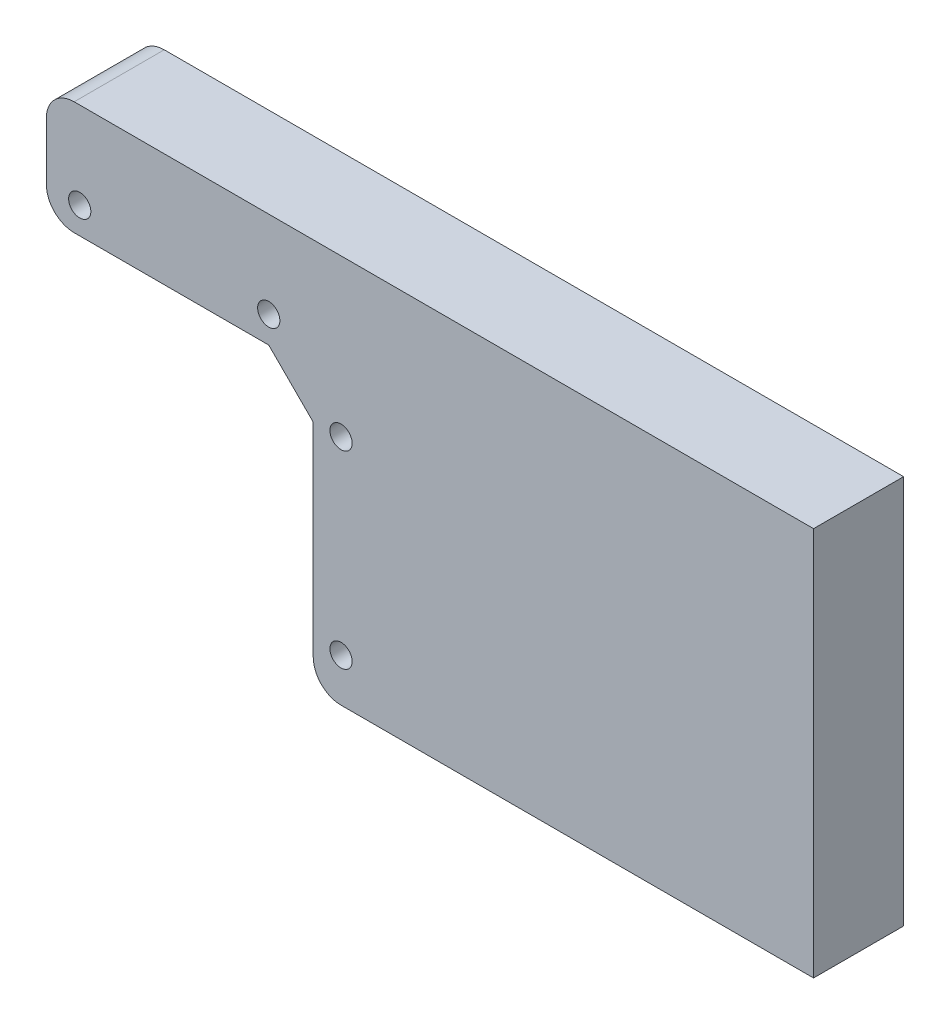
ISO-10303-21;
HEADER;
FILE_DESCRIPTION(('STEP AP214'),'2;1');
FILE_NAME('part.step','',(''),(''),'','','');
FILE_SCHEMA(('AUTOMOTIVE_DESIGN { 1 0 10303 214 1 1 1 1 }'));
ENDSEC;
DATA;
#1=APPLICATION_CONTEXT('core data for automotive mechanical design processes');
#2=APPLICATION_PROTOCOL_DEFINITION('international standard','automotive_design',2000,#1);
#3=PRODUCT_CONTEXT('',#1,'mechanical');
#4=PRODUCT('Part','Part','',(#3));
#5=PRODUCT_RELATED_PRODUCT_CATEGORY('part','',(#4));
#6=PRODUCT_DEFINITION_FORMATION('','',#4);
#7=PRODUCT_DEFINITION_CONTEXT('part definition',#1,'design');
#8=PRODUCT_DEFINITION('design','',#6,#7);
#9=PRODUCT_DEFINITION_SHAPE('','',#8);
#10=(LENGTH_UNIT() NAMED_UNIT(*) SI_UNIT(.MILLI.,.METRE.));
#11=(NAMED_UNIT(*) PLANE_ANGLE_UNIT() SI_UNIT($,.RADIAN.));
#12=(NAMED_UNIT(*) SI_UNIT($,.STERADIAN.) SOLID_ANGLE_UNIT());
#13=UNCERTAINTY_MEASURE_WITH_UNIT(LENGTH_MEASURE(1.E-05),#10,'distance_accuracy_value','');
#14=(GEOMETRIC_REPRESENTATION_CONTEXT(3) GLOBAL_UNCERTAINTY_ASSIGNED_CONTEXT((#13)) GLOBAL_UNIT_ASSIGNED_CONTEXT((#10,
#11,#12)) REPRESENTATION_CONTEXT('',''));
#15=CARTESIAN_POINT('',(0.,0.,0.));
#16=DIRECTION('',(0.,0.,1.));
#17=DIRECTION('',(1.,0.,0.));
#18=AXIS2_PLACEMENT_3D('',#15,#16,#17);
#19=CARTESIAN_POINT('',(0.,0.,8.1));
#20=DIRECTION('',(1.,0.,0.));
#21=DIRECTION('',(0.,0.,-1.));
#22=AXIS2_PLACEMENT_3D('',#19,#20,#21);
#23=PLANE('',#22);
#24=DIRECTION('',(0.,-1.,0.));
#25=VECTOR('',#24,1.);
#26=CARTESIAN_POINT('',(0.,0.,0.));
#27=LINE('',#26,#25);
#28=CARTESIAN_POINT('',(0.,20.8,0.));
#29=VERTEX_POINT('',#28);
#30=CARTESIAN_POINT('',(0.,2.5,0.));
#31=VERTEX_POINT('',#30);
#32=EDGE_CURVE('E141',#29,#31,#27,.T.);
#33=ORIENTED_EDGE('',*,*,#32,.T.);
#34=DIRECTION('',(0.,0.,-1.));
#35=VECTOR('',#34,1.);
#36=CARTESIAN_POINT('',(0.,2.5,8.1));
#37=LINE('',#36,#35);
#38=CARTESIAN_POINT('',(0.,2.5,8.1));
#39=VERTEX_POINT('',#38);
#40=EDGE_CURVE('E11',#31,#39,#37,.F.);
#41=ORIENTED_EDGE('',*,*,#40,.T.);
#42=DIRECTION('',(0.,-1.,0.));
#43=VECTOR('',#42,1.);
#44=CARTESIAN_POINT('',(0.,0.,8.1));
#45=LINE('',#44,#43);
#46=CARTESIAN_POINT('',(0.,20.8,8.1));
#47=VERTEX_POINT('',#46);
#48=EDGE_CURVE('E121',#47,#39,#45,.T.);
#49=ORIENTED_EDGE('',*,*,#48,.F.);
#50=DIRECTION('',(0.,0.,-1.));
#51=VECTOR('',#50,1.);
#52=CARTESIAN_POINT('',(0.,20.8,8.1));
#53=LINE('',#52,#51);
#54=EDGE_CURVE('E154',#47,#29,#53,.T.);
#55=ORIENTED_EDGE('',*,*,#54,.T.);
#56=EDGE_LOOP('',(#33,#41,#49,#55));
#57=FACE_BOUND('',#56,.T.);
#58=ADVANCED_FACE('F33',(#57),#23,.F.);
#59=CARTESIAN_POINT('',(0.,0.,8.1));
#60=DIRECTION('',(0.,1.,0.));
#61=DIRECTION('',(0.,0.,1.));
#62=AXIS2_PLACEMENT_3D('',#59,#60,#61);
#63=PLANE('',#62);
#64=DIRECTION('',(1.,0.,0.));
#65=VECTOR('',#64,1.);
#66=CARTESIAN_POINT('',(0.,0.,8.1));
#67=LINE('',#66,#65);
#68=CARTESIAN_POINT('',(2.5,0.,8.1));
#69=VERTEX_POINT('',#68);
#70=CARTESIAN_POINT('',(45.,0.,8.1));
#71=VERTEX_POINT('',#70);
#72=EDGE_CURVE('E110',#69,#71,#67,.T.);
#73=ORIENTED_EDGE('',*,*,#72,.F.);
#74=DIRECTION('',(0.,0.,-1.));
#75=VECTOR('',#74,1.);
#76=CARTESIAN_POINT('',(2.5,0.,8.1));
#77=LINE('',#76,#75);
#78=CARTESIAN_POINT('',(2.5,0.,0.));
#79=VERTEX_POINT('',#78);
#80=EDGE_CURVE('E41',#69,#79,#77,.T.);
#81=ORIENTED_EDGE('',*,*,#80,.T.);
#82=DIRECTION('',(1.,0.,0.));
#83=VECTOR('',#82,1.);
#84=CARTESIAN_POINT('',(0.,0.,0.));
#85=LINE('',#84,#83);
#86=CARTESIAN_POINT('',(45.,0.,0.));
#87=VERTEX_POINT('',#86);
#88=EDGE_CURVE('E127',#79,#87,#85,.T.);
#89=ORIENTED_EDGE('',*,*,#88,.T.);
#90=DIRECTION('',(0.,0.,-1.));
#91=VECTOR('',#90,1.);
#92=CARTESIAN_POINT('',(45.,0.,8.1));
#93=LINE('',#92,#91);
#94=EDGE_CURVE('E124',#71,#87,#93,.T.);
#95=ORIENTED_EDGE('',*,*,#94,.F.);
#96=EDGE_LOOP('',(#73,#81,#89,#95));
#97=FACE_BOUND('',#96,.T.);
#98=ADVANCED_FACE('F125',(#97),#63,.F.);
#99=CARTESIAN_POINT('',(45.,0.,8.1));
#100=DIRECTION('',(-1.,0.,0.));
#101=DIRECTION('',(0.,0.,1.));
#102=AXIS2_PLACEMENT_3D('',#99,#100,#101);
#103=PLANE('',#102);
#104=DIRECTION('',(0.,1.,0.));
#105=VECTOR('',#104,1.);
#106=CARTESIAN_POINT('',(45.,0.,0.));
#107=LINE('',#106,#105);
#108=CARTESIAN_POINT('',(45.,35.,0.));
#109=VERTEX_POINT('',#108);
#110=EDGE_CURVE('E146',#87,#109,#107,.T.);
#111=ORIENTED_EDGE('',*,*,#110,.T.);
#112=DIRECTION('',(0.,0.,-1.));
#113=VECTOR('',#112,1.);
#114=CARTESIAN_POINT('',(45.,35.,8.1));
#115=LINE('',#114,#113);
#116=CARTESIAN_POINT('',(45.,35.,8.1));
#117=VERTEX_POINT('',#116);
#118=EDGE_CURVE('E131',#117,#109,#115,.T.);
#119=ORIENTED_EDGE('',*,*,#118,.F.);
#120=DIRECTION('',(0.,1.,0.));
#121=VECTOR('',#120,1.);
#122=CARTESIAN_POINT('',(45.,0.,8.1));
#123=LINE('',#122,#121);
#124=EDGE_CURVE('E115',#71,#117,#123,.T.);
#125=ORIENTED_EDGE('',*,*,#124,.F.);
#126=ORIENTED_EDGE('',*,*,#94,.T.);
#127=EDGE_LOOP('',(#111,#119,#125,#126));
#128=FACE_BOUND('',#127,.T.);
#129=ADVANCED_FACE('F133',(#128),#103,.F.);
#130=CARTESIAN_POINT('',(0.,35.,8.1));
#131=DIRECTION('',(0.,-1.,0.));
#132=DIRECTION('',(0.,0.,-1.));
#133=AXIS2_PLACEMENT_3D('',#130,#131,#132);
#134=PLANE('',#133);
#135=DIRECTION('',(-1.,0.,0.));
#136=VECTOR('',#135,1.);
#137=CARTESIAN_POINT('',(0.,35.,0.));
#138=LINE('',#137,#136);
#139=CARTESIAN_POINT('',(-21.5,35.,0.));
#140=VERTEX_POINT('',#139);
#141=EDGE_CURVE('E148',#109,#140,#138,.T.);
#142=ORIENTED_EDGE('',*,*,#141,.T.);
#143=DIRECTION('',(0.,0.,1.));
#144=VECTOR('',#143,1.);
#145=CARTESIAN_POINT('',(-21.5,35.,8.1));
#146=LINE('',#145,#144);
#147=CARTESIAN_POINT('',(-21.5,35.,8.1));
#148=VERTEX_POINT('',#147);
#149=EDGE_CURVE('E161',#140,#148,#146,.T.);
#150=ORIENTED_EDGE('',*,*,#149,.T.);
#151=DIRECTION('',(-1.,0.,0.));
#152=VECTOR('',#151,1.);
#153=CARTESIAN_POINT('',(0.,35.,8.1));
#154=LINE('',#153,#152);
#155=EDGE_CURVE('E136',#117,#148,#154,.T.);
#156=ORIENTED_EDGE('',*,*,#155,.F.);
#157=ORIENTED_EDGE('',*,*,#118,.T.);
#158=EDGE_LOOP('',(#142,#150,#156,#157));
#159=FACE_BOUND('',#158,.T.);
#160=ADVANCED_FACE('F185',(#159),#134,.F.);
#161=CARTESIAN_POINT('',(0.,0.,8.1));
#162=DIRECTION('',(0.,0.,-1.));
#163=DIRECTION('',(-1.,0.,0.));
#164=AXIS2_PLACEMENT_3D('',#161,#162,#163);
#165=PLANE('',#164);
#166=CARTESIAN_POINT('',(-21.,27.2,8.1));
#167=DIRECTION('',(0.,0.,1.));
#168=DIRECTION('',(1.,0.,0.));
#169=AXIS2_PLACEMENT_3D('',#166,#167,#168);
#170=CIRCLE('',#169,1.);
#171=CARTESIAN_POINT('',(-20.,27.2,8.1));
#172=VERTEX_POINT('',#171);
#173=EDGE_CURVE('E390',#172,#172,#170,.T.);
#174=ORIENTED_EDGE('',*,*,#173,.F.);
#175=EDGE_LOOP('',(#174));
#176=FACE_BOUND('',#175,.T.);
#177=CARTESIAN_POINT('',(2.5,20.9,8.1));
#178=DIRECTION('',(0.,0.,1.));
#179=DIRECTION('',(1.,0.,0.));
#180=AXIS2_PLACEMENT_3D('',#177,#178,#179);
#181=CIRCLE('',#180,1.);
#182=CARTESIAN_POINT('',(3.5,20.9,8.1));
#183=VERTEX_POINT('',#182);
#184=EDGE_CURVE('E386',#183,#183,#181,.T.);
#185=ORIENTED_EDGE('',*,*,#184,.F.);
#186=EDGE_LOOP('',(#185));
#187=FACE_BOUND('',#186,.T.);
#188=CARTESIAN_POINT('',(2.5,3.9,8.1));
#189=DIRECTION('',(0.,0.,1.));
#190=DIRECTION('',(1.,0.,0.));
#191=AXIS2_PLACEMENT_3D('',#188,#189,#190);
#192=CIRCLE('',#191,1.);
#193=CARTESIAN_POINT('',(3.5,3.9,8.1));
#194=VERTEX_POINT('',#193);
#195=EDGE_CURVE('E382',#194,#194,#192,.T.);
#196=ORIENTED_EDGE('',*,*,#195,.F.);
#197=EDGE_LOOP('',(#196));
#198=FACE_BOUND('',#197,.T.);
#199=CARTESIAN_POINT('',(-4.,27.2,8.1));
#200=DIRECTION('',(0.,0.,1.));
#201=DIRECTION('',(1.,0.,0.));
#202=AXIS2_PLACEMENT_3D('',#199,#200,#201);
#203=CIRCLE('',#202,1.);
#204=CARTESIAN_POINT('',(-3.,27.2,8.1));
#205=VERTEX_POINT('',#204);
#206=EDGE_CURVE('E207',#205,#205,#203,.T.);
#207=ORIENTED_EDGE('',*,*,#206,.F.);
#208=EDGE_LOOP('',(#207));
#209=FACE_BOUND('',#208,.T.);
#210=ORIENTED_EDGE('',*,*,#155,.T.);
#211=CARTESIAN_POINT('',(-21.5,32.5,8.1));
#212=DIRECTION('',(0.,0.,-1.));
#213=DIRECTION('',(-1.,0.,0.));
#214=AXIS2_PLACEMENT_3D('',#211,#212,#213);
#215=CIRCLE('',#214,2.5);
#216=CARTESIAN_POINT('',(-24.,32.5,8.1));
#217=VERTEX_POINT('',#216);
#218=EDGE_CURVE('E167',#148,#217,#215,.F.);
#219=ORIENTED_EDGE('',*,*,#218,.T.);
#220=DIRECTION('',(0.,-1.,0.));
#221=VECTOR('',#220,1.);
#222=CARTESIAN_POINT('',(-24.,35.,8.1));
#223=LINE('',#222,#221);
#224=CARTESIAN_POINT('',(-24.,27.3,8.1));
#225=VERTEX_POINT('',#224);
#226=EDGE_CURVE('E189',#217,#225,#223,.T.);
#227=ORIENTED_EDGE('',*,*,#226,.T.);
#228=CARTESIAN_POINT('',(-21.5,27.3,8.1));
#229=DIRECTION('',(0.,0.,-1.));
#230=DIRECTION('',(-1.,0.,0.));
#231=AXIS2_PLACEMENT_3D('',#228,#229,#230);
#232=CIRCLE('',#231,2.5);
#233=CARTESIAN_POINT('',(-21.5,24.8,8.1));
#234=VERTEX_POINT('',#233);
#235=EDGE_CURVE('E165',#225,#234,#232,.F.);
#236=ORIENTED_EDGE('',*,*,#235,.T.);
#237=DIRECTION('',(1.,0.,0.));
#238=VECTOR('',#237,1.);
#239=CARTESIAN_POINT('',(0.,24.8,8.1));
#240=LINE('',#239,#238);
#241=CARTESIAN_POINT('',(-4.00000000000002,24.8,8.1));
#242=VERTEX_POINT('',#241);
#243=EDGE_CURVE('E196',#234,#242,#240,.T.);
#244=ORIENTED_EDGE('',*,*,#243,.T.);
#245=DIRECTION('',(0.707106781186551,-0.707106781186544,0.));
#246=VECTOR('',#245,1.);
#247=CARTESIAN_POINT('',(10.4,10.4000000000001,8.1));
#248=LINE('',#247,#246);
#249=EDGE_CURVE('E156',#242,#47,#248,.T.);
#250=ORIENTED_EDGE('',*,*,#249,.T.);
#251=ORIENTED_EDGE('',*,*,#48,.T.);
#252=CARTESIAN_POINT('',(2.5,2.5,8.1));
#253=DIRECTION('',(0.,0.,-1.));
#254=DIRECTION('',(-1.,0.,0.));
#255=AXIS2_PLACEMENT_3D('',#252,#253,#254);
#256=CIRCLE('',#255,2.5);
#257=EDGE_CURVE('E119',#39,#69,#256,.F.);
#258=ORIENTED_EDGE('',*,*,#257,.T.);
#259=ORIENTED_EDGE('',*,*,#72,.T.);
#260=ORIENTED_EDGE('',*,*,#124,.T.);
#261=EDGE_LOOP('',(#210,#219,#227,#236,#244,#250,#251,#258,#259,#260));
#262=FACE_BOUND('',#261,.T.);
#263=ADVANCED_FACE('F113',(#176,#187,#198,#209,#262),#165,.F.);
#264=CARTESIAN_POINT('',(0.,0.,0.));
#265=DIRECTION('',(0.,0.,-1.));
#266=DIRECTION('',(-1.,0.,0.));
#267=AXIS2_PLACEMENT_3D('',#264,#265,#266);
#268=PLANE('',#267);
#269=CARTESIAN_POINT('',(-21.,27.2,0.));
#270=DIRECTION('',(0.,0.,1.));
#271=DIRECTION('',(1.,0.,0.));
#272=AXIS2_PLACEMENT_3D('',#269,#270,#271);
#273=CIRCLE('',#272,1.);
#274=CARTESIAN_POINT('',(-20.,27.2,0.));
#275=VERTEX_POINT('',#274);
#276=EDGE_CURVE('E369',#275,#275,#273,.T.);
#277=ORIENTED_EDGE('',*,*,#276,.T.);
#278=EDGE_LOOP('',(#277));
#279=FACE_BOUND('',#278,.T.);
#280=CARTESIAN_POINT('',(2.5,20.9,0.));
#281=DIRECTION('',(0.,0.,1.));
#282=DIRECTION('',(1.,0.,0.));
#283=AXIS2_PLACEMENT_3D('',#280,#281,#282);
#284=CIRCLE('',#283,1.);
#285=CARTESIAN_POINT('',(3.5,20.9,0.));
#286=VERTEX_POINT('',#285);
#287=EDGE_CURVE('E373',#286,#286,#284,.T.);
#288=ORIENTED_EDGE('',*,*,#287,.T.);
#289=EDGE_LOOP('',(#288));
#290=FACE_BOUND('',#289,.T.);
#291=CARTESIAN_POINT('',(2.5,3.9,0.));
#292=DIRECTION('',(0.,0.,1.));
#293=DIRECTION('',(1.,0.,0.));
#294=AXIS2_PLACEMENT_3D('',#291,#292,#293);
#295=CIRCLE('',#294,1.);
#296=CARTESIAN_POINT('',(3.5,3.9,0.));
#297=VERTEX_POINT('',#296);
#298=EDGE_CURVE('E377',#297,#297,#295,.T.);
#299=ORIENTED_EDGE('',*,*,#298,.T.);
#300=EDGE_LOOP('',(#299));
#301=FACE_BOUND('',#300,.T.);
#302=CARTESIAN_POINT('',(-4.,27.2,0.));
#303=DIRECTION('',(0.,0.,1.));
#304=DIRECTION('',(1.,0.,0.));
#305=AXIS2_PLACEMENT_3D('',#302,#303,#304);
#306=CIRCLE('',#305,1.);
#307=CARTESIAN_POINT('',(-3.,27.2,0.));
#308=VERTEX_POINT('',#307);
#309=EDGE_CURVE('E197',#308,#308,#306,.T.);
#310=ORIENTED_EDGE('',*,*,#309,.T.);
#311=EDGE_LOOP('',(#310));
#312=FACE_BOUND('',#311,.T.);
#313=DIRECTION('',(0.,-1.,0.));
#314=VECTOR('',#313,1.);
#315=CARTESIAN_POINT('',(-24.,35.,0.));
#316=LINE('',#315,#314);
#317=CARTESIAN_POINT('',(-24.,32.5,0.));
#318=VERTEX_POINT('',#317);
#319=CARTESIAN_POINT('',(-24.,27.3,0.));
#320=VERTEX_POINT('',#319);
#321=EDGE_CURVE('E201',#318,#320,#316,.T.);
#322=ORIENTED_EDGE('',*,*,#321,.F.);
#323=CARTESIAN_POINT('',(-21.5,32.5,0.));
#324=DIRECTION('',(0.,0.,-1.));
#325=DIRECTION('',(-1.,0.,0.));
#326=AXIS2_PLACEMENT_3D('',#323,#324,#325);
#327=CIRCLE('',#326,2.5);
#328=EDGE_CURVE('E177',#318,#140,#327,.T.);
#329=ORIENTED_EDGE('',*,*,#328,.T.);
#330=ORIENTED_EDGE('',*,*,#141,.F.);
#331=ORIENTED_EDGE('',*,*,#110,.F.);
#332=ORIENTED_EDGE('',*,*,#88,.F.);
#333=CARTESIAN_POINT('',(2.5,2.5,0.));
#334=DIRECTION('',(0.,0.,-1.));
#335=DIRECTION('',(-1.,0.,0.));
#336=AXIS2_PLACEMENT_3D('',#333,#334,#335);
#337=CIRCLE('',#336,2.5);
#338=EDGE_CURVE('E48',#79,#31,#337,.T.);
#339=ORIENTED_EDGE('',*,*,#338,.T.);
#340=ORIENTED_EDGE('',*,*,#32,.F.);
#341=DIRECTION('',(-0.707106781186551,0.707106781186544,0.));
#342=VECTOR('',#341,1.);
#343=CARTESIAN_POINT('',(-4.00000000000002,24.8,0.));
#344=LINE('',#343,#342);
#345=CARTESIAN_POINT('',(-4.00000000000002,24.8,0.));
#346=VERTEX_POINT('',#345);
#347=EDGE_CURVE('E158',#29,#346,#344,.T.);
#348=ORIENTED_EDGE('',*,*,#347,.T.);
#349=DIRECTION('',(1.,0.,0.));
#350=VECTOR('',#349,1.);
#351=CARTESIAN_POINT('',(0.,24.8,0.));
#352=LINE('',#351,#350);
#353=CARTESIAN_POINT('',(-21.5,24.8,0.));
#354=VERTEX_POINT('',#353);
#355=EDGE_CURVE('E144',#354,#346,#352,.T.);
#356=ORIENTED_EDGE('',*,*,#355,.F.);
#357=CARTESIAN_POINT('',(-21.5,27.3,0.));
#358=DIRECTION('',(0.,0.,-1.));
#359=DIRECTION('',(-1.,0.,0.));
#360=AXIS2_PLACEMENT_3D('',#357,#358,#359);
#361=CIRCLE('',#360,2.5);
#362=EDGE_CURVE('E175',#354,#320,#361,.T.);
#363=ORIENTED_EDGE('',*,*,#362,.T.);
#364=EDGE_LOOP('',(#322,#329,#330,#331,#332,#339,#340,#348,#356,#363));
#365=FACE_BOUND('',#364,.T.);
#366=ADVANCED_FACE('F181',(#279,#290,#301,#312,#365),#268,.T.);
#367=CARTESIAN_POINT('',(0.,24.8,0.));
#368=DIRECTION('',(0.,-1.,0.));
#369=DIRECTION('',(1.,0.,0.));
#370=AXIS2_PLACEMENT_3D('',#367,#368,#369);
#371=PLANE('',#370);
#372=ORIENTED_EDGE('',*,*,#243,.F.);
#373=DIRECTION('',(0.,0.,1.));
#374=VECTOR('',#373,1.);
#375=CARTESIAN_POINT('',(-21.5,24.8,0.));
#376=LINE('',#375,#374);
#377=EDGE_CURVE('E56',#234,#354,#376,.F.);
#378=ORIENTED_EDGE('',*,*,#377,.T.);
#379=ORIENTED_EDGE('',*,*,#355,.T.);
#380=DIRECTION('',(0.,0.,1.));
#381=VECTOR('',#380,1.);
#382=CARTESIAN_POINT('',(-4.00000000000002,24.8,0.));
#383=LINE('',#382,#381);
#384=EDGE_CURVE('E130',#346,#242,#383,.T.);
#385=ORIENTED_EDGE('',*,*,#384,.T.);
#386=EDGE_LOOP('',(#372,#378,#379,#385));
#387=FACE_BOUND('',#386,.T.);
#388=ADVANCED_FACE('F217',(#387),#371,.T.);
#389=CARTESIAN_POINT('',(-24.,35.,0.));
#390=DIRECTION('',(-1.,0.,0.));
#391=DIRECTION('',(0.,0.,1.));
#392=AXIS2_PLACEMENT_3D('',#389,#390,#391);
#393=PLANE('',#392);
#394=ORIENTED_EDGE('',*,*,#226,.F.);
#395=DIRECTION('',(0.,0.,1.));
#396=VECTOR('',#395,1.);
#397=CARTESIAN_POINT('',(-24.,32.5,0.));
#398=LINE('',#397,#396);
#399=EDGE_CURVE('E172',#217,#318,#398,.F.);
#400=ORIENTED_EDGE('',*,*,#399,.T.);
#401=ORIENTED_EDGE('',*,*,#321,.T.);
#402=DIRECTION('',(0.,0.,1.));
#403=VECTOR('',#402,1.);
#404=CARTESIAN_POINT('',(-24.,27.3,0.));
#405=LINE('',#404,#403);
#406=EDGE_CURVE('E169',#320,#225,#405,.T.);
#407=ORIENTED_EDGE('',*,*,#406,.T.);
#408=EDGE_LOOP('',(#394,#400,#401,#407));
#409=FACE_BOUND('',#408,.T.);
#410=ADVANCED_FACE('F193',(#409),#393,.T.);
#411=CARTESIAN_POINT('',(-4.,27.2,0.));
#412=DIRECTION('',(0.,0.,1.));
#413=DIRECTION('',(1.,0.,0.));
#414=AXIS2_PLACEMENT_3D('',#411,#412,#413);
#415=CYLINDRICAL_SURFACE('',#414,1.);
#416=ORIENTED_EDGE('',*,*,#309,.F.);
#417=EDGE_LOOP('',(#416));
#418=FACE_BOUND('',#417,.T.);
#419=ORIENTED_EDGE('',*,*,#206,.T.);
#420=EDGE_LOOP('',(#419));
#421=FACE_BOUND('',#420,.T.);
#422=ADVANCED_FACE('F253',(#418,#421),#415,.F.);
#423=CARTESIAN_POINT('',(2.5,3.9,0.));
#424=DIRECTION('',(0.,0.,1.));
#425=DIRECTION('',(1.,0.,0.));
#426=AXIS2_PLACEMENT_3D('',#423,#424,#425);
#427=CYLINDRICAL_SURFACE('',#426,1.);
#428=ORIENTED_EDGE('',*,*,#298,.F.);
#429=EDGE_LOOP('',(#428));
#430=FACE_BOUND('',#429,.T.);
#431=ORIENTED_EDGE('',*,*,#195,.T.);
#432=EDGE_LOOP('',(#431));
#433=FACE_BOUND('',#432,.T.);
#434=ADVANCED_FACE('F245',(#430,#433),#427,.F.);
#435=CARTESIAN_POINT('',(2.5,20.9,0.));
#436=DIRECTION('',(0.,0.,1.));
#437=DIRECTION('',(1.,0.,0.));
#438=AXIS2_PLACEMENT_3D('',#435,#436,#437);
#439=CYLINDRICAL_SURFACE('',#438,1.);
#440=ORIENTED_EDGE('',*,*,#287,.F.);
#441=EDGE_LOOP('',(#440));
#442=FACE_BOUND('',#441,.T.);
#443=ORIENTED_EDGE('',*,*,#184,.T.);
#444=EDGE_LOOP('',(#443));
#445=FACE_BOUND('',#444,.T.);
#446=ADVANCED_FACE('F239',(#442,#445),#439,.F.);
#447=CARTESIAN_POINT('',(-21.,27.2,0.));
#448=DIRECTION('',(0.,0.,1.));
#449=DIRECTION('',(1.,0.,0.));
#450=AXIS2_PLACEMENT_3D('',#447,#448,#449);
#451=CYLINDRICAL_SURFACE('',#450,1.);
#452=ORIENTED_EDGE('',*,*,#276,.F.);
#453=EDGE_LOOP('',(#452));
#454=FACE_BOUND('',#453,.T.);
#455=ORIENTED_EDGE('',*,*,#173,.T.);
#456=EDGE_LOOP('',(#455));
#457=FACE_BOUND('',#456,.T.);
#458=ADVANCED_FACE('F235',(#454,#457),#451,.F.);
#459=CARTESIAN_POINT('',(-4.00000000000002,24.8,0.));
#460=DIRECTION('',(0.707106781186544,0.70710678118655,0.));
#461=DIRECTION('',(0.,0.,1.));
#462=AXIS2_PLACEMENT_3D('',#459,#460,#461);
#463=PLANE('',#462);
#464=ORIENTED_EDGE('',*,*,#347,.F.);
#465=ORIENTED_EDGE('',*,*,#54,.F.);
#466=ORIENTED_EDGE('',*,*,#249,.F.);
#467=ORIENTED_EDGE('',*,*,#384,.F.);
#468=EDGE_LOOP('',(#464,#465,#466,#467));
#469=FACE_BOUND('',#468,.T.);
#470=ADVANCED_FACE('F216',(#469),#463,.F.);
#471=CARTESIAN_POINT('',(-21.5,32.5,8.1));
#472=DIRECTION('',(0.,0.,-1.));
#473=DIRECTION('',(-1.,0.,0.));
#474=AXIS2_PLACEMENT_3D('',#471,#472,#473);
#475=CYLINDRICAL_SURFACE('',#474,2.5);
#476=ORIENTED_EDGE('',*,*,#328,.F.);
#477=ORIENTED_EDGE('',*,*,#399,.F.);
#478=ORIENTED_EDGE('',*,*,#218,.F.);
#479=ORIENTED_EDGE('',*,*,#149,.F.);
#480=EDGE_LOOP('',(#476,#477,#478,#479));
#481=FACE_BOUND('',#480,.T.);
#482=ADVANCED_FACE('F200',(#481),#475,.T.);
#483=CARTESIAN_POINT('',(-21.5,27.3,0.));
#484=DIRECTION('',(0.,0.,1.));
#485=DIRECTION('',(1.,0.,0.));
#486=AXIS2_PLACEMENT_3D('',#483,#484,#485);
#487=CYLINDRICAL_SURFACE('',#486,2.5);
#488=ORIENTED_EDGE('',*,*,#362,.F.);
#489=ORIENTED_EDGE('',*,*,#377,.F.);
#490=ORIENTED_EDGE('',*,*,#235,.F.);
#491=ORIENTED_EDGE('',*,*,#406,.F.);
#492=EDGE_LOOP('',(#488,#489,#490,#491));
#493=FACE_BOUND('',#492,.T.);
#494=ADVANCED_FACE('F219',(#493),#487,.T.);
#495=CARTESIAN_POINT('',(2.5,2.5,8.1));
#496=DIRECTION('',(0.,0.,-1.));
#497=DIRECTION('',(-1.,0.,0.));
#498=AXIS2_PLACEMENT_3D('',#495,#496,#497);
#499=CYLINDRICAL_SURFACE('',#498,2.5);
#500=ORIENTED_EDGE('',*,*,#257,.F.);
#501=ORIENTED_EDGE('',*,*,#40,.F.);
#502=ORIENTED_EDGE('',*,*,#338,.F.);
#503=ORIENTED_EDGE('',*,*,#80,.F.);
#504=EDGE_LOOP('',(#500,#501,#502,#503));
#505=FACE_BOUND('',#504,.T.);
#506=ADVANCED_FACE('F35',(#505),#499,.T.);
#507=CLOSED_SHELL('',(#58,#98,#129,#160,#263,#366,#388,#410,#422,#434,#446,#458,#470,#482,#494,#506));
#508=MANIFOLD_SOLID_BREP('B2',#507);
#509=ADVANCED_BREP_SHAPE_REPRESENTATION('',(#18,#508),#14);
#510=SHAPE_DEFINITION_REPRESENTATION(#9,#509);
ENDSEC;
END-ISO-10303-21;
